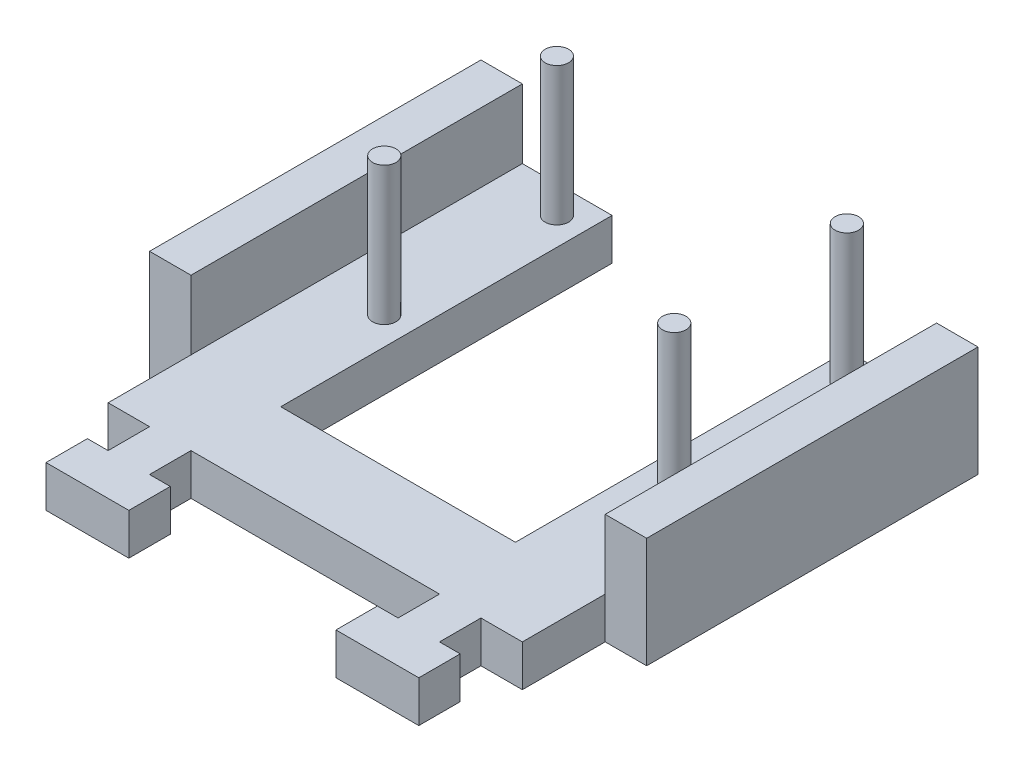
ISO-10303-21;
HEADER;
FILE_DESCRIPTION(('STEP AP214'),'2;1');
FILE_NAME('part.step','',(''),(''),'','','');
FILE_SCHEMA(('AUTOMOTIVE_DESIGN { 1 0 10303 214 1 1 1 1 }'));
ENDSEC;
DATA;
#1=APPLICATION_CONTEXT('core data for automotive mechanical design processes');
#2=APPLICATION_PROTOCOL_DEFINITION('international standard','automotive_design',2000,#1);
#3=PRODUCT_CONTEXT('',#1,'mechanical');
#4=PRODUCT('Part','Part','',(#3));
#5=PRODUCT_RELATED_PRODUCT_CATEGORY('part','',(#4));
#6=PRODUCT_DEFINITION_FORMATION('','',#4);
#7=PRODUCT_DEFINITION_CONTEXT('part definition',#1,'design');
#8=PRODUCT_DEFINITION('design','',#6,#7);
#9=PRODUCT_DEFINITION_SHAPE('','',#8);
#10=(LENGTH_UNIT() NAMED_UNIT(*) SI_UNIT(.MILLI.,.METRE.));
#11=(NAMED_UNIT(*) PLANE_ANGLE_UNIT() SI_UNIT($,.RADIAN.));
#12=(NAMED_UNIT(*) SI_UNIT($,.STERADIAN.) SOLID_ANGLE_UNIT());
#13=UNCERTAINTY_MEASURE_WITH_UNIT(LENGTH_MEASURE(1.E-05),#10,'distance_accuracy_value','');
#14=(GEOMETRIC_REPRESENTATION_CONTEXT(3) GLOBAL_UNCERTAINTY_ASSIGNED_CONTEXT((#13)) GLOBAL_UNIT_ASSIGNED_CONTEXT((#10,
#11,#12)) REPRESENTATION_CONTEXT('',''));
#15=CARTESIAN_POINT('',(0.,0.,0.));
#16=DIRECTION('',(0.,0.,1.));
#17=DIRECTION('',(1.,0.,0.));
#18=AXIS2_PLACEMENT_3D('',#15,#16,#17);
#19=CARTESIAN_POINT('',(0.,3.,0.));
#20=DIRECTION('',(0.,1.,0.));
#21=DIRECTION('',(0.,0.,1.));
#22=AXIS2_PLACEMENT_3D('',#19,#20,#21);
#23=PLANE('',#22);
#24=CARTESIAN_POINT('',(4.5,3.,-15.5));
#25=DIRECTION('',(0.,1.,0.));
#26=DIRECTION('',(0.,0.,1.));
#27=AXIS2_PLACEMENT_3D('',#24,#25,#26);
#28=CIRCLE('',#27,0.85);
#29=CARTESIAN_POINT('',(4.5,3.,-14.65));
#30=VERTEX_POINT('',#29);
#31=EDGE_CURVE('E915',#30,#30,#28,.T.);
#32=ORIENTED_EDGE('',*,*,#31,.F.);
#33=EDGE_LOOP('',(#32));
#34=FACE_BOUND('',#33,.T.);
#35=CARTESIAN_POINT('',(25.5,3.,-15.5));
#36=DIRECTION('',(0.,1.,0.));
#37=DIRECTION('',(0.,0.,1.));
#38=AXIS2_PLACEMENT_3D('',#35,#36,#37);
#39=CIRCLE('',#38,0.85);
#40=CARTESIAN_POINT('',(25.5,3.,-14.65));
#41=VERTEX_POINT('',#40);
#42=EDGE_CURVE('E918',#41,#41,#39,.T.);
#43=ORIENTED_EDGE('',*,*,#42,.F.);
#44=EDGE_LOOP('',(#43));
#45=FACE_BOUND('',#44,.T.);
#46=CARTESIAN_POINT('',(25.5,3.,-28.));
#47=DIRECTION('',(0.,1.,0.));
#48=DIRECTION('',(0.,0.,1.));
#49=AXIS2_PLACEMENT_3D('',#46,#47,#48);
#50=CIRCLE('',#49,0.85);
#51=CARTESIAN_POINT('',(25.5,3.,-27.15));
#52=VERTEX_POINT('',#51);
#53=EDGE_CURVE('E921',#52,#52,#50,.T.);
#54=ORIENTED_EDGE('',*,*,#53,.F.);
#55=EDGE_LOOP('',(#54));
#56=FACE_BOUND('',#55,.T.);
#57=CARTESIAN_POINT('',(4.5,3.,-28.));
#58=DIRECTION('',(0.,1.,0.));
#59=DIRECTION('',(0.,0.,1.));
#60=AXIS2_PLACEMENT_3D('',#57,#58,#59);
#61=CIRCLE('',#60,0.85);
#62=CARTESIAN_POINT('',(4.5,3.,-27.15));
#63=VERTEX_POINT('',#62);
#64=EDGE_CURVE('E924',#63,#63,#61,.T.);
#65=ORIENTED_EDGE('',*,*,#64,.F.);
#66=EDGE_LOOP('',(#65));
#67=FACE_BOUND('',#66,.T.);
#68=DIRECTION('',(0.,0.,-1.));
#69=VECTOR('',#68,1.);
#70=CARTESIAN_POINT('',(30.,3.,0.));
#71=LINE('',#70,#69);
#72=CARTESIAN_POINT('',(30.,3.,0.));
#73=VERTEX_POINT('',#72);
#74=CARTESIAN_POINT('',(30.,3.,-6.));
#75=VERTEX_POINT('',#74);
#76=EDGE_CURVE('E428',#73,#75,#71,.T.);
#77=ORIENTED_EDGE('',*,*,#76,.T.);
#78=DIRECTION('',(0.,0.,1.));
#79=VECTOR('',#78,1.);
#80=CARTESIAN_POINT('',(30.,3.,-30.));
#81=LINE('',#80,#79);
#82=CARTESIAN_POINT('',(30.,3.,-30.));
#83=VERTEX_POINT('',#82);
#84=EDGE_CURVE('E48',#83,#75,#81,.T.);
#85=ORIENTED_EDGE('',*,*,#84,.F.);
#86=DIRECTION('',(-1.,0.,0.));
#87=VECTOR('',#86,1.);
#88=CARTESIAN_POINT('',(23.5,3.,-30.));
#89=LINE('',#88,#87);
#90=CARTESIAN_POINT('',(23.5,3.,-30.));
#91=VERTEX_POINT('',#90);
#92=EDGE_CURVE('E430',#83,#91,#89,.T.);
#93=ORIENTED_EDGE('',*,*,#92,.T.);
#94=DIRECTION('',(0.,0.,1.));
#95=VECTOR('',#94,1.);
#96=CARTESIAN_POINT('',(23.5,3.,-6.));
#97=LINE('',#96,#95);
#98=CARTESIAN_POINT('',(23.5,3.,-6.));
#99=VERTEX_POINT('',#98);
#100=EDGE_CURVE('E226',#91,#99,#97,.T.);
#101=ORIENTED_EDGE('',*,*,#100,.T.);
#102=DIRECTION('',(-1.,0.,0.));
#103=VECTOR('',#102,1.);
#104=CARTESIAN_POINT('',(6.5,3.,-6.));
#105=LINE('',#104,#103);
#106=CARTESIAN_POINT('',(6.5,3.,-6.));
#107=VERTEX_POINT('',#106);
#108=EDGE_CURVE('E220',#99,#107,#105,.T.);
#109=ORIENTED_EDGE('',*,*,#108,.T.);
#110=DIRECTION('',(0.,0.,-1.));
#111=VECTOR('',#110,1.);
#112=CARTESIAN_POINT('',(6.5,3.,-30.));
#113=LINE('',#112,#111);
#114=CARTESIAN_POINT('',(6.5,3.,-30.));
#115=VERTEX_POINT('',#114);
#116=EDGE_CURVE('E223',#107,#115,#113,.T.);
#117=ORIENTED_EDGE('',*,*,#116,.T.);
#118=DIRECTION('',(-1.,0.,0.));
#119=VECTOR('',#118,1.);
#120=CARTESIAN_POINT('',(-3.,3.,-30.));
#121=LINE('',#120,#119);
#122=CARTESIAN_POINT('',(0.,3.,-30.));
#123=VERTEX_POINT('',#122);
#124=EDGE_CURVE('E244',#115,#123,#121,.T.);
#125=ORIENTED_EDGE('',*,*,#124,.T.);
#126=DIRECTION('',(0.,0.,-1.));
#127=VECTOR('',#126,1.);
#128=CARTESIAN_POINT('',(0.,3.,-6.));
#129=LINE('',#128,#127);
#130=CARTESIAN_POINT('',(0.,3.,-6.));
#131=VERTEX_POINT('',#130);
#132=EDGE_CURVE('E56',#131,#123,#129,.T.);
#133=ORIENTED_EDGE('',*,*,#132,.F.);
#134=DIRECTION('',(0.,0.,1.));
#135=VECTOR('',#134,1.);
#136=CARTESIAN_POINT('',(0.,3.,-6.));
#137=LINE('',#136,#135);
#138=CARTESIAN_POINT('',(0.,3.,0.));
#139=VERTEX_POINT('',#138);
#140=EDGE_CURVE('E306',#131,#139,#137,.T.);
#141=ORIENTED_EDGE('',*,*,#140,.T.);
#142=DIRECTION('',(1.,0.,0.));
#143=VECTOR('',#142,1.);
#144=CARTESIAN_POINT('',(0.,3.,0.));
#145=LINE('',#144,#143);
#146=CARTESIAN_POINT('',(3.,3.,0.));
#147=VERTEX_POINT('',#146);
#148=EDGE_CURVE('E158',#139,#147,#145,.T.);
#149=ORIENTED_EDGE('',*,*,#148,.T.);
#150=DIRECTION('',(0.,0.,1.));
#151=VECTOR('',#150,1.);
#152=CARTESIAN_POINT('',(3.,3.,0.));
#153=LINE('',#152,#151);
#154=CARTESIAN_POINT('',(3.,3.,3.));
#155=VERTEX_POINT('',#154);
#156=EDGE_CURVE('E380',#147,#155,#153,.T.);
#157=ORIENTED_EDGE('',*,*,#156,.T.);
#158=DIRECTION('',(-1.,0.,0.));
#159=VECTOR('',#158,1.);
#160=CARTESIAN_POINT('',(3.,3.,3.));
#161=LINE('',#160,#159);
#162=CARTESIAN_POINT('',(1.5,3.,3.));
#163=VERTEX_POINT('',#162);
#164=EDGE_CURVE('E398',#155,#163,#161,.T.);
#165=ORIENTED_EDGE('',*,*,#164,.T.);
#166=DIRECTION('',(0.,0.,1.));
#167=VECTOR('',#166,1.);
#168=CARTESIAN_POINT('',(1.5,3.,3.));
#169=LINE('',#168,#167);
#170=CARTESIAN_POINT('',(1.5,3.,6.));
#171=VERTEX_POINT('',#170);
#172=EDGE_CURVE('E395',#163,#171,#169,.T.);
#173=ORIENTED_EDGE('',*,*,#172,.T.);
#174=DIRECTION('',(1.,0.,0.));
#175=VECTOR('',#174,1.);
#176=CARTESIAN_POINT('',(1.5,3.,6.));
#177=LINE('',#176,#175);
#178=CARTESIAN_POINT('',(7.5,3.,6.));
#179=VERTEX_POINT('',#178);
#180=EDGE_CURVE('E397',#171,#179,#177,.T.);
#181=ORIENTED_EDGE('',*,*,#180,.T.);
#182=DIRECTION('',(0.,0.,-1.));
#183=VECTOR('',#182,1.);
#184=CARTESIAN_POINT('',(7.5,3.,6.));
#185=LINE('',#184,#183);
#186=CARTESIAN_POINT('',(7.5,3.,3.));
#187=VERTEX_POINT('',#186);
#188=EDGE_CURVE('E400',#179,#187,#185,.T.);
#189=ORIENTED_EDGE('',*,*,#188,.T.);
#190=DIRECTION('',(-1.,0.,0.));
#191=VECTOR('',#190,1.);
#192=CARTESIAN_POINT('',(7.5,3.,3.));
#193=LINE('',#192,#191);
#194=CARTESIAN_POINT('',(6.,3.,3.));
#195=VERTEX_POINT('',#194);
#196=EDGE_CURVE('E406',#187,#195,#193,.T.);
#197=ORIENTED_EDGE('',*,*,#196,.T.);
#198=DIRECTION('',(0.,0.,-1.));
#199=VECTOR('',#198,1.);
#200=CARTESIAN_POINT('',(6.,3.,3.));
#201=LINE('',#200,#199);
#202=CARTESIAN_POINT('',(6.,3.,0.));
#203=VERTEX_POINT('',#202);
#204=EDGE_CURVE('E408',#195,#203,#201,.T.);
#205=ORIENTED_EDGE('',*,*,#204,.T.);
#206=DIRECTION('',(1.,0.,0.));
#207=VECTOR('',#206,1.);
#208=CARTESIAN_POINT('',(6.,3.,0.));
#209=LINE('',#208,#207);
#210=CARTESIAN_POINT('',(24.,3.,0.));
#211=VERTEX_POINT('',#210);
#212=EDGE_CURVE('E410',#203,#211,#209,.T.);
#213=ORIENTED_EDGE('',*,*,#212,.T.);
#214=DIRECTION('',(0.,0.,1.));
#215=VECTOR('',#214,1.);
#216=CARTESIAN_POINT('',(24.,3.,0.));
#217=LINE('',#216,#215);
#218=CARTESIAN_POINT('',(24.,3.,3.));
#219=VERTEX_POINT('',#218);
#220=EDGE_CURVE('E412',#211,#219,#217,.T.);
#221=ORIENTED_EDGE('',*,*,#220,.T.);
#222=DIRECTION('',(-1.,0.,0.));
#223=VECTOR('',#222,1.);
#224=CARTESIAN_POINT('',(24.,3.,3.));
#225=LINE('',#224,#223);
#226=CARTESIAN_POINT('',(22.5,3.,3.));
#227=VERTEX_POINT('',#226);
#228=EDGE_CURVE('E414',#219,#227,#225,.T.);
#229=ORIENTED_EDGE('',*,*,#228,.T.);
#230=DIRECTION('',(0.,0.,1.));
#231=VECTOR('',#230,1.);
#232=CARTESIAN_POINT('',(22.5,3.,3.));
#233=LINE('',#232,#231);
#234=CARTESIAN_POINT('',(22.5,3.,6.));
#235=VERTEX_POINT('',#234);
#236=EDGE_CURVE('E416',#227,#235,#233,.T.);
#237=ORIENTED_EDGE('',*,*,#236,.T.);
#238=DIRECTION('',(1.,0.,0.));
#239=VECTOR('',#238,1.);
#240=CARTESIAN_POINT('',(22.5,3.,6.));
#241=LINE('',#240,#239);
#242=CARTESIAN_POINT('',(28.5,3.,6.));
#243=VERTEX_POINT('',#242);
#244=EDGE_CURVE('E418',#235,#243,#241,.T.);
#245=ORIENTED_EDGE('',*,*,#244,.T.);
#246=DIRECTION('',(0.,0.,-1.));
#247=VECTOR('',#246,1.);
#248=CARTESIAN_POINT('',(28.5,3.,6.));
#249=LINE('',#248,#247);
#250=CARTESIAN_POINT('',(28.5,3.,3.));
#251=VERTEX_POINT('',#250);
#252=EDGE_CURVE('E420',#243,#251,#249,.T.);
#253=ORIENTED_EDGE('',*,*,#252,.T.);
#254=DIRECTION('',(-1.,0.,0.));
#255=VECTOR('',#254,1.);
#256=CARTESIAN_POINT('',(28.5,3.,3.));
#257=LINE('',#256,#255);
#258=CARTESIAN_POINT('',(27.,3.,3.));
#259=VERTEX_POINT('',#258);
#260=EDGE_CURVE('E422',#251,#259,#257,.T.);
#261=ORIENTED_EDGE('',*,*,#260,.T.);
#262=DIRECTION('',(0.,0.,-1.));
#263=VECTOR('',#262,1.);
#264=CARTESIAN_POINT('',(27.,3.,3.));
#265=LINE('',#264,#263);
#266=CARTESIAN_POINT('',(27.,3.,0.));
#267=VERTEX_POINT('',#266);
#268=EDGE_CURVE('E424',#259,#267,#265,.T.);
#269=ORIENTED_EDGE('',*,*,#268,.T.);
#270=DIRECTION('',(1.,0.,0.));
#271=VECTOR('',#270,1.);
#272=CARTESIAN_POINT('',(27.,3.,0.));
#273=LINE('',#272,#271);
#274=EDGE_CURVE('E426',#267,#73,#273,.T.);
#275=ORIENTED_EDGE('',*,*,#274,.T.);
#276=EDGE_LOOP('',(#77,#85,#93,#101,#109,#117,#125,#133,#141,#149,#157,#165,#173,#181,#189,#197,
#205,#213,#221,#229,#237,#245,#253,#261,#269,#275));
#277=FACE_BOUND('',#276,.T.);
#278=ADVANCED_FACE('F33',(#34,#45,#56,#67,#277),#23,.T.);
#279=CARTESIAN_POINT('',(0.,3.,-6.));
#280=DIRECTION('',(1.,0.,0.));
#281=DIRECTION('',(0.,0.,-1.));
#282=AXIS2_PLACEMENT_3D('',#279,#280,#281);
#283=PLANE('',#282);
#284=DIRECTION('',(0.,0.,1.));
#285=VECTOR('',#284,1.);
#286=CARTESIAN_POINT('',(0.,0.,-6.));
#287=LINE('',#286,#285);
#288=CARTESIAN_POINT('',(0.,0.,-6.));
#289=VERTEX_POINT('',#288);
#290=CARTESIAN_POINT('',(0.,0.,0.));
#291=VERTEX_POINT('',#290);
#292=EDGE_CURVE('E250',#289,#291,#287,.T.);
#293=ORIENTED_EDGE('',*,*,#292,.T.);
#294=DIRECTION('',(0.,-1.,0.));
#295=VECTOR('',#294,1.);
#296=CARTESIAN_POINT('',(0.,3.,0.));
#297=LINE('',#296,#295);
#298=EDGE_CURVE('E11',#139,#291,#297,.T.);
#299=ORIENTED_EDGE('',*,*,#298,.F.);
#300=ORIENTED_EDGE('',*,*,#140,.F.);
#301=DIRECTION('',(0.,-1.,0.));
#302=VECTOR('',#301,1.);
#303=CARTESIAN_POINT('',(0.,3.,-6.));
#304=LINE('',#303,#302);
#305=EDGE_CURVE('E246',#131,#289,#304,.T.);
#306=ORIENTED_EDGE('',*,*,#305,.T.);
#307=EDGE_LOOP('',(#293,#299,#300,#306));
#308=FACE_BOUND('',#307,.T.);
#309=ADVANCED_FACE('F35',(#308),#283,.F.);
#310=CARTESIAN_POINT('',(0.,3.,0.));
#311=DIRECTION('',(0.,0.,-1.));
#312=DIRECTION('',(-1.,0.,0.));
#313=AXIS2_PLACEMENT_3D('',#310,#311,#312);
#314=PLANE('',#313);
#315=DIRECTION('',(1.,0.,0.));
#316=VECTOR('',#315,1.);
#317=CARTESIAN_POINT('',(0.,0.,0.));
#318=LINE('',#317,#316);
#319=CARTESIAN_POINT('',(3.,0.,0.));
#320=VERTEX_POINT('',#319);
#321=EDGE_CURVE('E253',#291,#320,#318,.T.);
#322=ORIENTED_EDGE('',*,*,#321,.T.);
#323=DIRECTION('',(0.,-1.,0.));
#324=VECTOR('',#323,1.);
#325=CARTESIAN_POINT('',(3.,3.,0.));
#326=LINE('',#325,#324);
#327=EDGE_CURVE('E41',#147,#320,#326,.T.);
#328=ORIENTED_EDGE('',*,*,#327,.F.);
#329=ORIENTED_EDGE('',*,*,#148,.F.);
#330=ORIENTED_EDGE('',*,*,#298,.T.);
#331=EDGE_LOOP('',(#322,#328,#329,#330));
#332=FACE_BOUND('',#331,.T.);
#333=ADVANCED_FACE('F475',(#332),#314,.F.);
#334=CARTESIAN_POINT('',(3.,3.,0.));
#335=DIRECTION('',(1.,0.,0.));
#336=DIRECTION('',(0.,0.,-1.));
#337=AXIS2_PLACEMENT_3D('',#334,#335,#336);
#338=PLANE('',#337);
#339=DIRECTION('',(0.,0.,1.));
#340=VECTOR('',#339,1.);
#341=CARTESIAN_POINT('',(3.,0.,0.));
#342=LINE('',#341,#340);
#343=CARTESIAN_POINT('',(3.,0.,3.));
#344=VERTEX_POINT('',#343);
#345=EDGE_CURVE('E256',#320,#344,#342,.T.);
#346=ORIENTED_EDGE('',*,*,#345,.T.);
#347=DIRECTION('',(0.,-1.,0.));
#348=VECTOR('',#347,1.);
#349=CARTESIAN_POINT('',(3.,3.,3.));
#350=LINE('',#349,#348);
#351=EDGE_CURVE('E372',#155,#344,#350,.T.);
#352=ORIENTED_EDGE('',*,*,#351,.F.);
#353=ORIENTED_EDGE('',*,*,#156,.F.);
#354=ORIENTED_EDGE('',*,*,#327,.T.);
#355=EDGE_LOOP('',(#346,#352,#353,#354));
#356=FACE_BOUND('',#355,.T.);
#357=ADVANCED_FACE('F378',(#356),#338,.F.);
#358=CARTESIAN_POINT('',(3.,3.,3.));
#359=DIRECTION('',(0.,0.,1.));
#360=DIRECTION('',(1.,0.,0.));
#361=AXIS2_PLACEMENT_3D('',#358,#359,#360);
#362=PLANE('',#361);
#363=DIRECTION('',(-1.,0.,0.));
#364=VECTOR('',#363,1.);
#365=CARTESIAN_POINT('',(3.,0.,3.));
#366=LINE('',#365,#364);
#367=CARTESIAN_POINT('',(1.5,0.,3.));
#368=VERTEX_POINT('',#367);
#369=EDGE_CURVE('E258',#344,#368,#366,.T.);
#370=ORIENTED_EDGE('',*,*,#369,.T.);
#371=DIRECTION('',(0.,-1.,0.));
#372=VECTOR('',#371,1.);
#373=CARTESIAN_POINT('',(1.5,3.,3.));
#374=LINE('',#373,#372);
#375=EDGE_CURVE('E369',#163,#368,#374,.T.);
#376=ORIENTED_EDGE('',*,*,#375,.F.);
#377=ORIENTED_EDGE('',*,*,#164,.F.);
#378=ORIENTED_EDGE('',*,*,#351,.T.);
#379=EDGE_LOOP('',(#370,#376,#377,#378));
#380=FACE_BOUND('',#379,.T.);
#381=ADVANCED_FACE('F389',(#380),#362,.F.);
#382=CARTESIAN_POINT('',(1.5,3.,3.));
#383=DIRECTION('',(1.,0.,0.));
#384=DIRECTION('',(0.,0.,-1.));
#385=AXIS2_PLACEMENT_3D('',#382,#383,#384);
#386=PLANE('',#385);
#387=DIRECTION('',(0.,0.,1.));
#388=VECTOR('',#387,1.);
#389=CARTESIAN_POINT('',(1.5,0.,3.));
#390=LINE('',#389,#388);
#391=CARTESIAN_POINT('',(1.5,0.,6.));
#392=VERTEX_POINT('',#391);
#393=EDGE_CURVE('E260',#368,#392,#390,.T.);
#394=ORIENTED_EDGE('',*,*,#393,.T.);
#395=DIRECTION('',(0.,-1.,0.));
#396=VECTOR('',#395,1.);
#397=CARTESIAN_POINT('',(1.5,3.,6.));
#398=LINE('',#397,#396);
#399=EDGE_CURVE('E366',#171,#392,#398,.T.);
#400=ORIENTED_EDGE('',*,*,#399,.F.);
#401=ORIENTED_EDGE('',*,*,#172,.F.);
#402=ORIENTED_EDGE('',*,*,#375,.T.);
#403=EDGE_LOOP('',(#394,#400,#401,#402));
#404=FACE_BOUND('',#403,.T.);
#405=ADVANCED_FACE('F393',(#404),#386,.F.);
#406=CARTESIAN_POINT('',(1.5,3.,6.));
#407=DIRECTION('',(0.,0.,-1.));
#408=DIRECTION('',(-1.,0.,0.));
#409=AXIS2_PLACEMENT_3D('',#406,#407,#408);
#410=PLANE('',#409);
#411=DIRECTION('',(1.,0.,0.));
#412=VECTOR('',#411,1.);
#413=CARTESIAN_POINT('',(1.5,0.,6.));
#414=LINE('',#413,#412);
#415=CARTESIAN_POINT('',(7.5,0.,6.));
#416=VERTEX_POINT('',#415);
#417=EDGE_CURVE('E262',#392,#416,#414,.T.);
#418=ORIENTED_EDGE('',*,*,#417,.T.);
#419=DIRECTION('',(0.,-1.,0.));
#420=VECTOR('',#419,1.);
#421=CARTESIAN_POINT('',(7.5,3.,6.));
#422=LINE('',#421,#420);
#423=EDGE_CURVE('E363',#179,#416,#422,.T.);
#424=ORIENTED_EDGE('',*,*,#423,.F.);
#425=ORIENTED_EDGE('',*,*,#180,.F.);
#426=ORIENTED_EDGE('',*,*,#399,.T.);
#427=EDGE_LOOP('',(#418,#424,#425,#426));
#428=FACE_BOUND('',#427,.T.);
#429=ADVANCED_FACE('F570',(#428),#410,.F.);
#430=CARTESIAN_POINT('',(7.5,3.,6.));
#431=DIRECTION('',(-1.,0.,0.));
#432=DIRECTION('',(0.,0.,1.));
#433=AXIS2_PLACEMENT_3D('',#430,#431,#432);
#434=PLANE('',#433);
#435=DIRECTION('',(0.,0.,-1.));
#436=VECTOR('',#435,1.);
#437=CARTESIAN_POINT('',(7.5,0.,6.));
#438=LINE('',#437,#436);
#439=CARTESIAN_POINT('',(7.5,0.,3.));
#440=VERTEX_POINT('',#439);
#441=EDGE_CURVE('E264',#416,#440,#438,.T.);
#442=ORIENTED_EDGE('',*,*,#441,.T.);
#443=DIRECTION('',(0.,-1.,0.));
#444=VECTOR('',#443,1.);
#445=CARTESIAN_POINT('',(7.5,3.,3.));
#446=LINE('',#445,#444);
#447=EDGE_CURVE('E360',#187,#440,#446,.T.);
#448=ORIENTED_EDGE('',*,*,#447,.F.);
#449=ORIENTED_EDGE('',*,*,#188,.F.);
#450=ORIENTED_EDGE('',*,*,#423,.T.);
#451=EDGE_LOOP('',(#442,#448,#449,#450));
#452=FACE_BOUND('',#451,.T.);
#453=ADVANCED_FACE('F566',(#452),#434,.F.);
#454=CARTESIAN_POINT('',(7.5,3.,3.));
#455=DIRECTION('',(0.,0.,1.));
#456=DIRECTION('',(1.,0.,0.));
#457=AXIS2_PLACEMENT_3D('',#454,#455,#456);
#458=PLANE('',#457);
#459=DIRECTION('',(-1.,0.,0.));
#460=VECTOR('',#459,1.);
#461=CARTESIAN_POINT('',(7.5,0.,3.));
#462=LINE('',#461,#460);
#463=CARTESIAN_POINT('',(6.,0.,3.));
#464=VERTEX_POINT('',#463);
#465=EDGE_CURVE('E266',#440,#464,#462,.T.);
#466=ORIENTED_EDGE('',*,*,#465,.T.);
#467=DIRECTION('',(0.,-1.,0.));
#468=VECTOR('',#467,1.);
#469=CARTESIAN_POINT('',(6.,3.,3.));
#470=LINE('',#469,#468);
#471=EDGE_CURVE('E357',#195,#464,#470,.T.);
#472=ORIENTED_EDGE('',*,*,#471,.F.);
#473=ORIENTED_EDGE('',*,*,#196,.F.);
#474=ORIENTED_EDGE('',*,*,#447,.T.);
#475=EDGE_LOOP('',(#466,#472,#473,#474));
#476=FACE_BOUND('',#475,.T.);
#477=ADVANCED_FACE('F562',(#476),#458,.F.);
#478=CARTESIAN_POINT('',(6.,3.,3.));
#479=DIRECTION('',(-1.,0.,0.));
#480=DIRECTION('',(0.,0.,1.));
#481=AXIS2_PLACEMENT_3D('',#478,#479,#480);
#482=PLANE('',#481);
#483=DIRECTION('',(0.,0.,-1.));
#484=VECTOR('',#483,1.);
#485=CARTESIAN_POINT('',(6.,0.,3.));
#486=LINE('',#485,#484);
#487=CARTESIAN_POINT('',(6.,0.,0.));
#488=VERTEX_POINT('',#487);
#489=EDGE_CURVE('E268',#464,#488,#486,.T.);
#490=ORIENTED_EDGE('',*,*,#489,.T.);
#491=DIRECTION('',(0.,-1.,0.));
#492=VECTOR('',#491,1.);
#493=CARTESIAN_POINT('',(6.,3.,0.));
#494=LINE('',#493,#492);
#495=EDGE_CURVE('E354',#203,#488,#494,.T.);
#496=ORIENTED_EDGE('',*,*,#495,.F.);
#497=ORIENTED_EDGE('',*,*,#204,.F.);
#498=ORIENTED_EDGE('',*,*,#471,.T.);
#499=EDGE_LOOP('',(#490,#496,#497,#498));
#500=FACE_BOUND('',#499,.T.);
#501=ADVANCED_FACE('F558',(#500),#482,.F.);
#502=CARTESIAN_POINT('',(6.,3.,0.));
#503=DIRECTION('',(0.,0.,-1.));
#504=DIRECTION('',(-1.,0.,0.));
#505=AXIS2_PLACEMENT_3D('',#502,#503,#504);
#506=PLANE('',#505);
#507=DIRECTION('',(1.,0.,0.));
#508=VECTOR('',#507,1.);
#509=CARTESIAN_POINT('',(6.,0.,0.));
#510=LINE('',#509,#508);
#511=CARTESIAN_POINT('',(24.,0.,0.));
#512=VERTEX_POINT('',#511);
#513=EDGE_CURVE('E270',#488,#512,#510,.T.);
#514=ORIENTED_EDGE('',*,*,#513,.T.);
#515=DIRECTION('',(0.,-1.,0.));
#516=VECTOR('',#515,1.);
#517=CARTESIAN_POINT('',(24.,3.,0.));
#518=LINE('',#517,#516);
#519=EDGE_CURVE('E351',#211,#512,#518,.T.);
#520=ORIENTED_EDGE('',*,*,#519,.F.);
#521=ORIENTED_EDGE('',*,*,#212,.F.);
#522=ORIENTED_EDGE('',*,*,#495,.T.);
#523=EDGE_LOOP('',(#514,#520,#521,#522));
#524=FACE_BOUND('',#523,.T.);
#525=ADVANCED_FACE('F554',(#524),#506,.F.);
#526=CARTESIAN_POINT('',(24.,3.,0.));
#527=DIRECTION('',(1.,0.,0.));
#528=DIRECTION('',(0.,0.,-1.));
#529=AXIS2_PLACEMENT_3D('',#526,#527,#528);
#530=PLANE('',#529);
#531=DIRECTION('',(0.,0.,1.));
#532=VECTOR('',#531,1.);
#533=CARTESIAN_POINT('',(24.,0.,0.));
#534=LINE('',#533,#532);
#535=CARTESIAN_POINT('',(24.,0.,3.));
#536=VERTEX_POINT('',#535);
#537=EDGE_CURVE('E272',#512,#536,#534,.T.);
#538=ORIENTED_EDGE('',*,*,#537,.T.);
#539=DIRECTION('',(0.,-1.,0.));
#540=VECTOR('',#539,1.);
#541=CARTESIAN_POINT('',(24.,3.,3.));
#542=LINE('',#541,#540);
#543=EDGE_CURVE('E348',#219,#536,#542,.T.);
#544=ORIENTED_EDGE('',*,*,#543,.F.);
#545=ORIENTED_EDGE('',*,*,#220,.F.);
#546=ORIENTED_EDGE('',*,*,#519,.T.);
#547=EDGE_LOOP('',(#538,#544,#545,#546));
#548=FACE_BOUND('',#547,.T.);
#549=ADVANCED_FACE('F550',(#548),#530,.F.);
#550=CARTESIAN_POINT('',(24.,3.,3.));
#551=DIRECTION('',(0.,0.,1.));
#552=DIRECTION('',(1.,0.,0.));
#553=AXIS2_PLACEMENT_3D('',#550,#551,#552);
#554=PLANE('',#553);
#555=DIRECTION('',(-1.,0.,0.));
#556=VECTOR('',#555,1.);
#557=CARTESIAN_POINT('',(24.,0.,3.));
#558=LINE('',#557,#556);
#559=CARTESIAN_POINT('',(22.5,0.,3.));
#560=VERTEX_POINT('',#559);
#561=EDGE_CURVE('E274',#536,#560,#558,.T.);
#562=ORIENTED_EDGE('',*,*,#561,.T.);
#563=DIRECTION('',(0.,-1.,0.));
#564=VECTOR('',#563,1.);
#565=CARTESIAN_POINT('',(22.5,3.,3.));
#566=LINE('',#565,#564);
#567=EDGE_CURVE('E345',#227,#560,#566,.T.);
#568=ORIENTED_EDGE('',*,*,#567,.F.);
#569=ORIENTED_EDGE('',*,*,#228,.F.);
#570=ORIENTED_EDGE('',*,*,#543,.T.);
#571=EDGE_LOOP('',(#562,#568,#569,#570));
#572=FACE_BOUND('',#571,.T.);
#573=ADVANCED_FACE('F546',(#572),#554,.F.);
#574=CARTESIAN_POINT('',(22.5,3.,3.));
#575=DIRECTION('',(1.,0.,0.));
#576=DIRECTION('',(0.,0.,-1.));
#577=AXIS2_PLACEMENT_3D('',#574,#575,#576);
#578=PLANE('',#577);
#579=DIRECTION('',(0.,0.,1.));
#580=VECTOR('',#579,1.);
#581=CARTESIAN_POINT('',(22.5,0.,3.));
#582=LINE('',#581,#580);
#583=CARTESIAN_POINT('',(22.5,0.,6.));
#584=VERTEX_POINT('',#583);
#585=EDGE_CURVE('E276',#560,#584,#582,.T.);
#586=ORIENTED_EDGE('',*,*,#585,.T.);
#587=DIRECTION('',(0.,-1.,0.));
#588=VECTOR('',#587,1.);
#589=CARTESIAN_POINT('',(22.5,3.,6.));
#590=LINE('',#589,#588);
#591=EDGE_CURVE('E342',#235,#584,#590,.T.);
#592=ORIENTED_EDGE('',*,*,#591,.F.);
#593=ORIENTED_EDGE('',*,*,#236,.F.);
#594=ORIENTED_EDGE('',*,*,#567,.T.);
#595=EDGE_LOOP('',(#586,#592,#593,#594));
#596=FACE_BOUND('',#595,.T.);
#597=ADVANCED_FACE('F542',(#596),#578,.F.);
#598=CARTESIAN_POINT('',(22.5,3.,6.));
#599=DIRECTION('',(0.,0.,-1.));
#600=DIRECTION('',(-1.,0.,0.));
#601=AXIS2_PLACEMENT_3D('',#598,#599,#600);
#602=PLANE('',#601);
#603=DIRECTION('',(1.,0.,0.));
#604=VECTOR('',#603,1.);
#605=CARTESIAN_POINT('',(22.5,0.,6.));
#606=LINE('',#605,#604);
#607=CARTESIAN_POINT('',(28.5,0.,6.));
#608=VERTEX_POINT('',#607);
#609=EDGE_CURVE('E278',#584,#608,#606,.T.);
#610=ORIENTED_EDGE('',*,*,#609,.T.);
#611=DIRECTION('',(0.,-1.,0.));
#612=VECTOR('',#611,1.);
#613=CARTESIAN_POINT('',(28.5,3.,6.));
#614=LINE('',#613,#612);
#615=EDGE_CURVE('E339',#243,#608,#614,.T.);
#616=ORIENTED_EDGE('',*,*,#615,.F.);
#617=ORIENTED_EDGE('',*,*,#244,.F.);
#618=ORIENTED_EDGE('',*,*,#591,.T.);
#619=EDGE_LOOP('',(#610,#616,#617,#618));
#620=FACE_BOUND('',#619,.T.);
#621=ADVANCED_FACE('F538',(#620),#602,.F.);
#622=CARTESIAN_POINT('',(28.5,3.,6.));
#623=DIRECTION('',(-1.,0.,0.));
#624=DIRECTION('',(0.,0.,1.));
#625=AXIS2_PLACEMENT_3D('',#622,#623,#624);
#626=PLANE('',#625);
#627=DIRECTION('',(0.,0.,-1.));
#628=VECTOR('',#627,1.);
#629=CARTESIAN_POINT('',(28.5,0.,6.));
#630=LINE('',#629,#628);
#631=CARTESIAN_POINT('',(28.5,0.,3.));
#632=VERTEX_POINT('',#631);
#633=EDGE_CURVE('E280',#608,#632,#630,.T.);
#634=ORIENTED_EDGE('',*,*,#633,.T.);
#635=DIRECTION('',(0.,-1.,0.));
#636=VECTOR('',#635,1.);
#637=CARTESIAN_POINT('',(28.5,3.,3.));
#638=LINE('',#637,#636);
#639=EDGE_CURVE('E336',#251,#632,#638,.T.);
#640=ORIENTED_EDGE('',*,*,#639,.F.);
#641=ORIENTED_EDGE('',*,*,#252,.F.);
#642=ORIENTED_EDGE('',*,*,#615,.T.);
#643=EDGE_LOOP('',(#634,#640,#641,#642));
#644=FACE_BOUND('',#643,.T.);
#645=ADVANCED_FACE('F534',(#644),#626,.F.);
#646=CARTESIAN_POINT('',(28.5,3.,3.));
#647=DIRECTION('',(0.,0.,1.));
#648=DIRECTION('',(1.,0.,0.));
#649=AXIS2_PLACEMENT_3D('',#646,#647,#648);
#650=PLANE('',#649);
#651=DIRECTION('',(-1.,0.,0.));
#652=VECTOR('',#651,1.);
#653=CARTESIAN_POINT('',(28.5,0.,3.));
#654=LINE('',#653,#652);
#655=CARTESIAN_POINT('',(27.,0.,3.));
#656=VERTEX_POINT('',#655);
#657=EDGE_CURVE('E282',#632,#656,#654,.T.);
#658=ORIENTED_EDGE('',*,*,#657,.T.);
#659=DIRECTION('',(0.,-1.,0.));
#660=VECTOR('',#659,1.);
#661=CARTESIAN_POINT('',(27.,3.,3.));
#662=LINE('',#661,#660);
#663=EDGE_CURVE('E333',#259,#656,#662,.T.);
#664=ORIENTED_EDGE('',*,*,#663,.F.);
#665=ORIENTED_EDGE('',*,*,#260,.F.);
#666=ORIENTED_EDGE('',*,*,#639,.T.);
#667=EDGE_LOOP('',(#658,#664,#665,#666));
#668=FACE_BOUND('',#667,.T.);
#669=ADVANCED_FACE('F530',(#668),#650,.F.);
#670=CARTESIAN_POINT('',(27.,3.,3.));
#671=DIRECTION('',(-1.,0.,0.));
#672=DIRECTION('',(0.,0.,1.));
#673=AXIS2_PLACEMENT_3D('',#670,#671,#672);
#674=PLANE('',#673);
#675=DIRECTION('',(0.,0.,-1.));
#676=VECTOR('',#675,1.);
#677=CARTESIAN_POINT('',(27.,0.,3.));
#678=LINE('',#677,#676);
#679=CARTESIAN_POINT('',(27.,0.,0.));
#680=VERTEX_POINT('',#679);
#681=EDGE_CURVE('E284',#656,#680,#678,.T.);
#682=ORIENTED_EDGE('',*,*,#681,.T.);
#683=DIRECTION('',(0.,-1.,0.));
#684=VECTOR('',#683,1.);
#685=CARTESIAN_POINT('',(27.,3.,0.));
#686=LINE('',#685,#684);
#687=EDGE_CURVE('E330',#267,#680,#686,.T.);
#688=ORIENTED_EDGE('',*,*,#687,.F.);
#689=ORIENTED_EDGE('',*,*,#268,.F.);
#690=ORIENTED_EDGE('',*,*,#663,.T.);
#691=EDGE_LOOP('',(#682,#688,#689,#690));
#692=FACE_BOUND('',#691,.T.);
#693=ADVANCED_FACE('F526',(#692),#674,.F.);
#694=CARTESIAN_POINT('',(27.,3.,0.));
#695=DIRECTION('',(0.,0.,-1.));
#696=DIRECTION('',(-1.,0.,0.));
#697=AXIS2_PLACEMENT_3D('',#694,#695,#696);
#698=PLANE('',#697);
#699=DIRECTION('',(1.,0.,0.));
#700=VECTOR('',#699,1.);
#701=CARTESIAN_POINT('',(27.,0.,0.));
#702=LINE('',#701,#700);
#703=CARTESIAN_POINT('',(30.,0.,0.));
#704=VERTEX_POINT('',#703);
#705=EDGE_CURVE('E286',#680,#704,#702,.T.);
#706=ORIENTED_EDGE('',*,*,#705,.T.);
#707=DIRECTION('',(0.,-1.,0.));
#708=VECTOR('',#707,1.);
#709=CARTESIAN_POINT('',(30.,3.,0.));
#710=LINE('',#709,#708);
#711=EDGE_CURVE('E327',#73,#704,#710,.T.);
#712=ORIENTED_EDGE('',*,*,#711,.F.);
#713=ORIENTED_EDGE('',*,*,#274,.F.);
#714=ORIENTED_EDGE('',*,*,#687,.T.);
#715=EDGE_LOOP('',(#706,#712,#713,#714));
#716=FACE_BOUND('',#715,.T.);
#717=ADVANCED_FACE('F522',(#716),#698,.F.);
#718=CARTESIAN_POINT('',(30.,3.,0.));
#719=DIRECTION('',(-1.,0.,0.));
#720=DIRECTION('',(0.,0.,1.));
#721=AXIS2_PLACEMENT_3D('',#718,#719,#720);
#722=PLANE('',#721);
#723=DIRECTION('',(0.,0.,-1.));
#724=VECTOR('',#723,1.);
#725=CARTESIAN_POINT('',(30.,0.,0.));
#726=LINE('',#725,#724);
#727=CARTESIAN_POINT('',(30.,0.,-6.));
#728=VERTEX_POINT('',#727);
#729=EDGE_CURVE('E288',#704,#728,#726,.T.);
#730=ORIENTED_EDGE('',*,*,#729,.T.);
#731=DIRECTION('',(0.,-1.,0.));
#732=VECTOR('',#731,1.);
#733=CARTESIAN_POINT('',(30.,3.,-6.));
#734=LINE('',#733,#732);
#735=EDGE_CURVE('E324',#75,#728,#734,.T.);
#736=ORIENTED_EDGE('',*,*,#735,.F.);
#737=ORIENTED_EDGE('',*,*,#76,.F.);
#738=ORIENTED_EDGE('',*,*,#711,.T.);
#739=EDGE_LOOP('',(#730,#736,#737,#738));
#740=FACE_BOUND('',#739,.T.);
#741=ADVANCED_FACE('F518',(#740),#722,.F.);
#742=CARTESIAN_POINT('',(30.,3.,-6.));
#743=DIRECTION('',(0.,0.,-1.));
#744=DIRECTION('',(-1.,0.,0.));
#745=AXIS2_PLACEMENT_3D('',#742,#743,#744);
#746=PLANE('',#745);
#747=DIRECTION('',(1.,0.,0.));
#748=VECTOR('',#747,1.);
#749=CARTESIAN_POINT('',(30.,0.,-6.));
#750=LINE('',#749,#748);
#751=CARTESIAN_POINT('',(33.,0.,-6.));
#752=VERTEX_POINT('',#751);
#753=EDGE_CURVE('E290',#728,#752,#750,.T.);
#754=ORIENTED_EDGE('',*,*,#753,.T.);
#755=DIRECTION('',(0.,-1.,0.));
#756=VECTOR('',#755,1.);
#757=CARTESIAN_POINT('',(33.,3.,-6.));
#758=LINE('',#757,#756);
#759=CARTESIAN_POINT('',(33.,8.,-6.));
#760=VERTEX_POINT('',#759);
#761=EDGE_CURVE('E321',#760,#752,#758,.T.);
#762=ORIENTED_EDGE('',*,*,#761,.F.);
#763=DIRECTION('',(1.,0.,0.));
#764=VECTOR('',#763,1.);
#765=CARTESIAN_POINT('',(30.,8.,-6.));
#766=LINE('',#765,#764);
#767=CARTESIAN_POINT('',(30.,8.,-6.));
#768=VERTEX_POINT('',#767);
#769=EDGE_CURVE('E936',#768,#760,#766,.T.);
#770=ORIENTED_EDGE('',*,*,#769,.F.);
#771=DIRECTION('',(0.,-1.,0.));
#772=VECTOR('',#771,1.);
#773=CARTESIAN_POINT('',(30.,8.,-6.));
#774=LINE('',#773,#772);
#775=EDGE_CURVE('E463',#768,#75,#774,.T.);
#776=ORIENTED_EDGE('',*,*,#775,.T.);
#777=ORIENTED_EDGE('',*,*,#735,.T.);
#778=EDGE_LOOP('',(#754,#762,#770,#776,#777));
#779=FACE_BOUND('',#778,.T.);
#780=ADVANCED_FACE('F514',(#779),#746,.F.);
#781=CARTESIAN_POINT('',(33.,3.,-6.));
#782=DIRECTION('',(-1.,0.,0.));
#783=DIRECTION('',(0.,0.,1.));
#784=AXIS2_PLACEMENT_3D('',#781,#782,#783);
#785=PLANE('',#784);
#786=DIRECTION('',(0.,0.,-1.));
#787=VECTOR('',#786,1.);
#788=CARTESIAN_POINT('',(33.,0.,-6.));
#789=LINE('',#788,#787);
#790=CARTESIAN_POINT('',(33.,0.,-30.));
#791=VERTEX_POINT('',#790);
#792=EDGE_CURVE('E292',#752,#791,#789,.T.);
#793=ORIENTED_EDGE('',*,*,#792,.T.);
#794=DIRECTION('',(0.,-1.,0.));
#795=VECTOR('',#794,1.);
#796=CARTESIAN_POINT('',(33.,3.,-30.));
#797=LINE('',#796,#795);
#798=CARTESIAN_POINT('',(33.,8.,-30.));
#799=VERTEX_POINT('',#798);
#800=EDGE_CURVE('E318',#799,#791,#797,.T.);
#801=ORIENTED_EDGE('',*,*,#800,.F.);
#802=DIRECTION('',(0.,0.,-1.));
#803=VECTOR('',#802,1.);
#804=CARTESIAN_POINT('',(33.,8.,-6.));
#805=LINE('',#804,#803);
#806=EDGE_CURVE('E927',#760,#799,#805,.T.);
#807=ORIENTED_EDGE('',*,*,#806,.F.);
#808=ORIENTED_EDGE('',*,*,#761,.T.);
#809=EDGE_LOOP('',(#793,#801,#807,#808));
#810=FACE_BOUND('',#809,.T.);
#811=ADVANCED_FACE('F511',(#810),#785,.F.);
#812=CARTESIAN_POINT('',(23.5,3.,-30.));
#813=DIRECTION('',(0.,0.,1.));
#814=DIRECTION('',(1.,0.,0.));
#815=AXIS2_PLACEMENT_3D('',#812,#813,#814);
#816=PLANE('',#815);
#817=DIRECTION('',(-1.,0.,0.));
#818=VECTOR('',#817,1.);
#819=CARTESIAN_POINT('',(23.5,0.,-30.));
#820=LINE('',#819,#818);
#821=CARTESIAN_POINT('',(23.5,0.,-30.));
#822=VERTEX_POINT('',#821);
#823=EDGE_CURVE('E294',#791,#822,#820,.T.);
#824=ORIENTED_EDGE('',*,*,#823,.T.);
#825=DIRECTION('',(0.,-1.,0.));
#826=VECTOR('',#825,1.);
#827=CARTESIAN_POINT('',(23.5,3.,-30.));
#828=LINE('',#827,#826);
#829=EDGE_CURVE('E315',#91,#822,#828,.T.);
#830=ORIENTED_EDGE('',*,*,#829,.F.);
#831=ORIENTED_EDGE('',*,*,#92,.F.);
#832=DIRECTION('',(0.,-1.,0.));
#833=VECTOR('',#832,1.);
#834=CARTESIAN_POINT('',(30.,8.,-30.));
#835=LINE('',#834,#833);
#836=CARTESIAN_POINT('',(30.,8.,-30.));
#837=VERTEX_POINT('',#836);
#838=EDGE_CURVE('E458',#837,#83,#835,.T.);
#839=ORIENTED_EDGE('',*,*,#838,.F.);
#840=DIRECTION('',(-1.,0.,0.));
#841=VECTOR('',#840,1.);
#842=CARTESIAN_POINT('',(33.,8.,-30.));
#843=LINE('',#842,#841);
#844=EDGE_CURVE('E930',#799,#837,#843,.T.);
#845=ORIENTED_EDGE('',*,*,#844,.F.);
#846=ORIENTED_EDGE('',*,*,#800,.T.);
#847=EDGE_LOOP('',(#824,#830,#831,#839,#845,#846));
#848=FACE_BOUND('',#847,.T.);
#849=ADVANCED_FACE('F435',(#848),#816,.F.);
#850=CARTESIAN_POINT('',(23.5,3.,-6.));
#851=DIRECTION('',(1.,0.,0.));
#852=DIRECTION('',(0.,0.,-1.));
#853=AXIS2_PLACEMENT_3D('',#850,#851,#852);
#854=PLANE('',#853);
#855=DIRECTION('',(0.,0.,1.));
#856=VECTOR('',#855,1.);
#857=CARTESIAN_POINT('',(23.5,0.,-6.));
#858=LINE('',#857,#856);
#859=CARTESIAN_POINT('',(23.5,0.,-6.));
#860=VERTEX_POINT('',#859);
#861=EDGE_CURVE('E296',#822,#860,#858,.T.);
#862=ORIENTED_EDGE('',*,*,#861,.T.);
#863=DIRECTION('',(0.,-1.,0.));
#864=VECTOR('',#863,1.);
#865=CARTESIAN_POINT('',(23.5,3.,-6.));
#866=LINE('',#865,#864);
#867=EDGE_CURVE('E238',#99,#860,#866,.T.);
#868=ORIENTED_EDGE('',*,*,#867,.F.);
#869=ORIENTED_EDGE('',*,*,#100,.F.);
#870=ORIENTED_EDGE('',*,*,#829,.T.);
#871=EDGE_LOOP('',(#862,#868,#869,#870));
#872=FACE_BOUND('',#871,.T.);
#873=ADVANCED_FACE('F439',(#872),#854,.F.);
#874=CARTESIAN_POINT('',(6.5,3.,-6.));
#875=DIRECTION('',(0.,0.,1.));
#876=DIRECTION('',(1.,0.,0.));
#877=AXIS2_PLACEMENT_3D('',#874,#875,#876);
#878=PLANE('',#877);
#879=DIRECTION('',(-1.,0.,0.));
#880=VECTOR('',#879,1.);
#881=CARTESIAN_POINT('',(6.5,0.,-6.));
#882=LINE('',#881,#880);
#883=CARTESIAN_POINT('',(6.5,0.,-6.));
#884=VERTEX_POINT('',#883);
#885=EDGE_CURVE('E235',#860,#884,#882,.T.);
#886=ORIENTED_EDGE('',*,*,#885,.T.);
#887=DIRECTION('',(0.,-1.,0.));
#888=VECTOR('',#887,1.);
#889=CARTESIAN_POINT('',(6.5,3.,-6.));
#890=LINE('',#889,#888);
#891=EDGE_CURVE('E232',#107,#884,#890,.T.);
#892=ORIENTED_EDGE('',*,*,#891,.F.);
#893=ORIENTED_EDGE('',*,*,#108,.F.);
#894=ORIENTED_EDGE('',*,*,#867,.T.);
#895=EDGE_LOOP('',(#886,#892,#893,#894));
#896=FACE_BOUND('',#895,.T.);
#897=ADVANCED_FACE('F233',(#896),#878,.F.);
#898=CARTESIAN_POINT('',(6.5,3.,-30.));
#899=DIRECTION('',(-1.,0.,0.));
#900=DIRECTION('',(0.,0.,1.));
#901=AXIS2_PLACEMENT_3D('',#898,#899,#900);
#902=PLANE('',#901);
#903=DIRECTION('',(0.,0.,-1.));
#904=VECTOR('',#903,1.);
#905=CARTESIAN_POINT('',(6.5,0.,-30.));
#906=LINE('',#905,#904);
#907=CARTESIAN_POINT('',(6.5,0.,-30.));
#908=VERTEX_POINT('',#907);
#909=EDGE_CURVE('E299',#884,#908,#906,.T.);
#910=ORIENTED_EDGE('',*,*,#909,.T.);
#911=DIRECTION('',(0.,-1.,0.));
#912=VECTOR('',#911,1.);
#913=CARTESIAN_POINT('',(6.5,3.,-30.));
#914=LINE('',#913,#912);
#915=EDGE_CURVE('E239',#115,#908,#914,.T.);
#916=ORIENTED_EDGE('',*,*,#915,.F.);
#917=ORIENTED_EDGE('',*,*,#116,.F.);
#918=ORIENTED_EDGE('',*,*,#891,.T.);
#919=EDGE_LOOP('',(#910,#916,#917,#918));
#920=FACE_BOUND('',#919,.T.);
#921=ADVANCED_FACE('F241',(#920),#902,.F.);
#922=CARTESIAN_POINT('',(-3.,3.,-30.));
#923=DIRECTION('',(0.,0.,1.));
#924=DIRECTION('',(1.,0.,0.));
#925=AXIS2_PLACEMENT_3D('',#922,#923,#924);
#926=PLANE('',#925);
#927=DIRECTION('',(-1.,0.,0.));
#928=VECTOR('',#927,1.);
#929=CARTESIAN_POINT('',(-3.,0.,-30.));
#930=LINE('',#929,#928);
#931=CARTESIAN_POINT('',(-3.,0.,-30.));
#932=VERTEX_POINT('',#931);
#933=EDGE_CURVE('E301',#908,#932,#930,.T.);
#934=ORIENTED_EDGE('',*,*,#933,.T.);
#935=DIRECTION('',(0.,-1.,0.));
#936=VECTOR('',#935,1.);
#937=CARTESIAN_POINT('',(-3.,3.,-30.));
#938=LINE('',#937,#936);
#939=CARTESIAN_POINT('',(-3.,8.,-30.));
#940=VERTEX_POINT('',#939);
#941=EDGE_CURVE('E310',#940,#932,#938,.T.);
#942=ORIENTED_EDGE('',*,*,#941,.F.);
#943=DIRECTION('',(-1.,0.,0.));
#944=VECTOR('',#943,1.);
#945=CARTESIAN_POINT('',(0.,8.,-30.));
#946=LINE('',#945,#944);
#947=CARTESIAN_POINT('',(0.,8.,-30.));
#948=VERTEX_POINT('',#947);
#949=EDGE_CURVE('E943',#948,#940,#946,.T.);
#950=ORIENTED_EDGE('',*,*,#949,.F.);
#951=DIRECTION('',(0.,-1.,0.));
#952=VECTOR('',#951,1.);
#953=CARTESIAN_POINT('',(0.,8.,-30.));
#954=LINE('',#953,#952);
#955=EDGE_CURVE('E448',#948,#123,#954,.T.);
#956=ORIENTED_EDGE('',*,*,#955,.T.);
#957=ORIENTED_EDGE('',*,*,#124,.F.);
#958=ORIENTED_EDGE('',*,*,#915,.T.);
#959=EDGE_LOOP('',(#934,#942,#950,#956,#957,#958));
#960=FACE_BOUND('',#959,.T.);
#961=ADVANCED_FACE('F443',(#960),#926,.F.);
#962=CARTESIAN_POINT('',(-3.,3.,-30.));
#963=DIRECTION('',(1.,0.,0.));
#964=DIRECTION('',(0.,0.,-1.));
#965=AXIS2_PLACEMENT_3D('',#962,#963,#964);
#966=PLANE('',#965);
#967=DIRECTION('',(0.,0.,1.));
#968=VECTOR('',#967,1.);
#969=CARTESIAN_POINT('',(-3.,0.,-30.));
#970=LINE('',#969,#968);
#971=CARTESIAN_POINT('',(-3.,0.,-6.));
#972=VERTEX_POINT('',#971);
#973=EDGE_CURVE('E303',#932,#972,#970,.T.);
#974=ORIENTED_EDGE('',*,*,#973,.T.);
#975=DIRECTION('',(0.,-1.,0.));
#976=VECTOR('',#975,1.);
#977=CARTESIAN_POINT('',(-3.,3.,-6.));
#978=LINE('',#977,#976);
#979=CARTESIAN_POINT('',(-3.,8.,-6.));
#980=VERTEX_POINT('',#979);
#981=EDGE_CURVE('E308',#980,#972,#978,.T.);
#982=ORIENTED_EDGE('',*,*,#981,.F.);
#983=DIRECTION('',(0.,0.,1.));
#984=VECTOR('',#983,1.);
#985=CARTESIAN_POINT('',(-3.,8.,-30.));
#986=LINE('',#985,#984);
#987=EDGE_CURVE('E467',#940,#980,#986,.T.);
#988=ORIENTED_EDGE('',*,*,#987,.F.);
#989=ORIENTED_EDGE('',*,*,#941,.T.);
#990=EDGE_LOOP('',(#974,#982,#988,#989));
#991=FACE_BOUND('',#990,.T.);
#992=ADVANCED_FACE('F497',(#991),#966,.F.);
#993=CARTESIAN_POINT('',(-3.,3.,-6.));
#994=DIRECTION('',(0.,0.,-1.));
#995=DIRECTION('',(-1.,0.,0.));
#996=AXIS2_PLACEMENT_3D('',#993,#994,#995);
#997=PLANE('',#996);
#998=DIRECTION('',(1.,0.,0.));
#999=VECTOR('',#998,1.);
#1000=CARTESIAN_POINT('',(-3.,0.,-6.));
#1001=LINE('',#1000,#999);
#1002=EDGE_CURVE('E150',#972,#289,#1001,.T.);
#1003=ORIENTED_EDGE('',*,*,#1002,.T.);
#1004=ORIENTED_EDGE('',*,*,#305,.F.);
#1005=DIRECTION('',(0.,-1.,0.));
#1006=VECTOR('',#1005,1.);
#1007=CARTESIAN_POINT('',(0.,8.,-6.));
#1008=LINE('',#1007,#1006);
#1009=CARTESIAN_POINT('',(0.,8.,-6.));
#1010=VERTEX_POINT('',#1009);
#1011=EDGE_CURVE('E254',#1010,#131,#1008,.T.);
#1012=ORIENTED_EDGE('',*,*,#1011,.F.);
#1013=DIRECTION('',(1.,0.,0.));
#1014=VECTOR('',#1013,1.);
#1015=CARTESIAN_POINT('',(-3.,8.,-6.));
#1016=LINE('',#1015,#1014);
#1017=EDGE_CURVE('E457',#980,#1010,#1016,.T.);
#1018=ORIENTED_EDGE('',*,*,#1017,.F.);
#1019=ORIENTED_EDGE('',*,*,#981,.T.);
#1020=EDGE_LOOP('',(#1003,#1004,#1012,#1018,#1019));
#1021=FACE_BOUND('',#1020,.T.);
#1022=ADVANCED_FACE('F494',(#1021),#997,.F.);
#1023=CARTESIAN_POINT('',(0.,0.,0.));
#1024=DIRECTION('',(0.,1.,0.));
#1025=DIRECTION('',(0.,0.,1.));
#1026=AXIS2_PLACEMENT_3D('',#1023,#1024,#1025);
#1027=PLANE('',#1026);
#1028=ORIENTED_EDGE('',*,*,#292,.F.);
#1029=ORIENTED_EDGE('',*,*,#1002,.F.);
#1030=ORIENTED_EDGE('',*,*,#973,.F.);
#1031=ORIENTED_EDGE('',*,*,#933,.F.);
#1032=ORIENTED_EDGE('',*,*,#909,.F.);
#1033=ORIENTED_EDGE('',*,*,#885,.F.);
#1034=ORIENTED_EDGE('',*,*,#861,.F.);
#1035=ORIENTED_EDGE('',*,*,#823,.F.);
#1036=ORIENTED_EDGE('',*,*,#792,.F.);
#1037=ORIENTED_EDGE('',*,*,#753,.F.);
#1038=ORIENTED_EDGE('',*,*,#729,.F.);
#1039=ORIENTED_EDGE('',*,*,#705,.F.);
#1040=ORIENTED_EDGE('',*,*,#681,.F.);
#1041=ORIENTED_EDGE('',*,*,#657,.F.);
#1042=ORIENTED_EDGE('',*,*,#633,.F.);
#1043=ORIENTED_EDGE('',*,*,#609,.F.);
#1044=ORIENTED_EDGE('',*,*,#585,.F.);
#1045=ORIENTED_EDGE('',*,*,#561,.F.);
#1046=ORIENTED_EDGE('',*,*,#537,.F.);
#1047=ORIENTED_EDGE('',*,*,#513,.F.);
#1048=ORIENTED_EDGE('',*,*,#489,.F.);
#1049=ORIENTED_EDGE('',*,*,#465,.F.);
#1050=ORIENTED_EDGE('',*,*,#441,.F.);
#1051=ORIENTED_EDGE('',*,*,#417,.F.);
#1052=ORIENTED_EDGE('',*,*,#393,.F.);
#1053=ORIENTED_EDGE('',*,*,#369,.F.);
#1054=ORIENTED_EDGE('',*,*,#345,.F.);
#1055=ORIENTED_EDGE('',*,*,#321,.F.);
#1056=EDGE_LOOP('',(#1028,#1029,#1030,#1031,#1032,#1033,#1034,#1035,#1036,#1037,#1038,#1039,
#1040,#1041,#1042,#1043,#1044,#1045,#1046,#1047,#1048,#1049,#1050,#1051,#1052,#1053,#1054,#1055));
#1057=FACE_BOUND('',#1056,.T.);
#1058=ADVANCED_FACE('F384',(#1057),#1027,.F.);
#1059=CARTESIAN_POINT('',(0.,8.,-6.));
#1060=DIRECTION('',(-1.,0.,0.));
#1061=DIRECTION('',(0.,0.,1.));
#1062=AXIS2_PLACEMENT_3D('',#1059,#1060,#1061);
#1063=PLANE('',#1062);
#1064=ORIENTED_EDGE('',*,*,#132,.T.);
#1065=ORIENTED_EDGE('',*,*,#955,.F.);
#1066=DIRECTION('',(0.,0.,-1.));
#1067=VECTOR('',#1066,1.);
#1068=CARTESIAN_POINT('',(0.,8.,-6.));
#1069=LINE('',#1068,#1067);
#1070=EDGE_CURVE('E461',#1010,#948,#1069,.T.);
#1071=ORIENTED_EDGE('',*,*,#1070,.F.);
#1072=ORIENTED_EDGE('',*,*,#1011,.T.);
#1073=EDGE_LOOP('',(#1064,#1065,#1071,#1072));
#1074=FACE_BOUND('',#1073,.T.);
#1075=ADVANCED_FACE('F453',(#1074),#1063,.F.);
#1076=CARTESIAN_POINT('',(0.,8.,0.));
#1077=DIRECTION('',(0.,1.,0.));
#1078=DIRECTION('',(0.,0.,1.));
#1079=AXIS2_PLACEMENT_3D('',#1076,#1077,#1078);
#1080=PLANE('',#1079);
#1081=ORIENTED_EDGE('',*,*,#1017,.T.);
#1082=ORIENTED_EDGE('',*,*,#1070,.T.);
#1083=ORIENTED_EDGE('',*,*,#949,.T.);
#1084=ORIENTED_EDGE('',*,*,#987,.T.);
#1085=EDGE_LOOP('',(#1081,#1082,#1083,#1084));
#1086=FACE_BOUND('',#1085,.T.);
#1087=ADVANCED_FACE('F689',(#1086),#1080,.T.);
#1088=CARTESIAN_POINT('',(30.,8.,-30.));
#1089=DIRECTION('',(1.,0.,0.));
#1090=DIRECTION('',(0.,0.,-1.));
#1091=AXIS2_PLACEMENT_3D('',#1088,#1089,#1090);
#1092=PLANE('',#1091);
#1093=ORIENTED_EDGE('',*,*,#84,.T.);
#1094=ORIENTED_EDGE('',*,*,#775,.F.);
#1095=DIRECTION('',(0.,0.,1.));
#1096=VECTOR('',#1095,1.);
#1097=CARTESIAN_POINT('',(30.,8.,-30.));
#1098=LINE('',#1097,#1096);
#1099=EDGE_CURVE('E933',#837,#768,#1098,.T.);
#1100=ORIENTED_EDGE('',*,*,#1099,.F.);
#1101=ORIENTED_EDGE('',*,*,#838,.T.);
#1102=EDGE_LOOP('',(#1093,#1094,#1100,#1101));
#1103=FACE_BOUND('',#1102,.T.);
#1104=ADVANCED_FACE('F695',(#1103),#1092,.F.);
#1105=CARTESIAN_POINT('',(0.,8.,0.));
#1106=DIRECTION('',(0.,1.,0.));
#1107=DIRECTION('',(0.,0.,1.));
#1108=AXIS2_PLACEMENT_3D('',#1105,#1106,#1107);
#1109=PLANE('',#1108);
#1110=ORIENTED_EDGE('',*,*,#806,.T.);
#1111=ORIENTED_EDGE('',*,*,#844,.T.);
#1112=ORIENTED_EDGE('',*,*,#1099,.T.);
#1113=ORIENTED_EDGE('',*,*,#769,.T.);
#1114=EDGE_LOOP('',(#1110,#1111,#1112,#1113));
#1115=FACE_BOUND('',#1114,.T.);
#1116=ADVANCED_FACE('F702',(#1115),#1109,.T.);
#1117=CARTESIAN_POINT('',(4.5,8.,-28.));
#1118=DIRECTION('',(0.,-1.,0.));
#1119=DIRECTION('',(0.,0.,-1.));
#1120=AXIS2_PLACEMENT_3D('',#1117,#1118,#1119);
#1121=CYLINDRICAL_SURFACE('',#1120,0.85);
#1122=ORIENTED_EDGE('',*,*,#64,.T.);
#1123=EDGE_LOOP('',(#1122));
#1124=FACE_BOUND('',#1123,.T.);
#1125=CARTESIAN_POINT('',(4.5,13.,-28.));
#1126=DIRECTION('',(0.,1.,0.));
#1127=DIRECTION('',(0.,0.,1.));
#1128=AXIS2_PLACEMENT_3D('',#1125,#1126,#1127);
#1129=CIRCLE('',#1128,0.85);
#1130=CARTESIAN_POINT('',(4.5,13.,-27.15));
#1131=VERTEX_POINT('',#1130);
#1132=EDGE_CURVE('E912',#1131,#1131,#1129,.T.);
#1133=ORIENTED_EDGE('',*,*,#1132,.F.);
#1134=EDGE_LOOP('',(#1133));
#1135=FACE_BOUND('',#1134,.T.);
#1136=ADVANCED_FACE('F710',(#1124,#1135),#1121,.T.);
#1137=CARTESIAN_POINT('',(25.5,8.,-28.));
#1138=DIRECTION('',(0.,-1.,0.));
#1139=DIRECTION('',(0.,0.,-1.));
#1140=AXIS2_PLACEMENT_3D('',#1137,#1138,#1139);
#1141=CYLINDRICAL_SURFACE('',#1140,0.85);
#1142=ORIENTED_EDGE('',*,*,#53,.T.);
#1143=EDGE_LOOP('',(#1142));
#1144=FACE_BOUND('',#1143,.T.);
#1145=CARTESIAN_POINT('',(25.5,13.,-28.));
#1146=DIRECTION('',(0.,1.,0.));
#1147=DIRECTION('',(0.,0.,1.));
#1148=AXIS2_PLACEMENT_3D('',#1145,#1146,#1147);
#1149=CIRCLE('',#1148,0.85);
#1150=CARTESIAN_POINT('',(25.5,13.,-27.15));
#1151=VERTEX_POINT('',#1150);
#1152=EDGE_CURVE('E907',#1151,#1151,#1149,.T.);
#1153=ORIENTED_EDGE('',*,*,#1152,.F.);
#1154=EDGE_LOOP('',(#1153));
#1155=FACE_BOUND('',#1154,.T.);
#1156=ADVANCED_FACE('F718',(#1144,#1155),#1141,.T.);
#1157=CARTESIAN_POINT('',(25.5,8.,-15.5));
#1158=DIRECTION('',(0.,-1.,0.));
#1159=DIRECTION('',(0.,0.,-1.));
#1160=AXIS2_PLACEMENT_3D('',#1157,#1158,#1159);
#1161=CYLINDRICAL_SURFACE('',#1160,0.85);
#1162=ORIENTED_EDGE('',*,*,#42,.T.);
#1163=EDGE_LOOP('',(#1162));
#1164=FACE_BOUND('',#1163,.T.);
#1165=CARTESIAN_POINT('',(25.5,13.,-15.5));
#1166=DIRECTION('',(0.,1.,0.));
#1167=DIRECTION('',(0.,0.,1.));
#1168=AXIS2_PLACEMENT_3D('',#1165,#1166,#1167);
#1169=CIRCLE('',#1168,0.85);
#1170=CARTESIAN_POINT('',(25.5,13.,-14.65));
#1171=VERTEX_POINT('',#1170);
#1172=EDGE_CURVE('E904',#1171,#1171,#1169,.T.);
#1173=ORIENTED_EDGE('',*,*,#1172,.F.);
#1174=EDGE_LOOP('',(#1173));
#1175=FACE_BOUND('',#1174,.T.);
#1176=ADVANCED_FACE('F726',(#1164,#1175),#1161,.T.);
#1177=CARTESIAN_POINT('',(4.5,8.,-15.5));
#1178=DIRECTION('',(0.,-1.,0.));
#1179=DIRECTION('',(0.,0.,-1.));
#1180=AXIS2_PLACEMENT_3D('',#1177,#1178,#1179);
#1181=CYLINDRICAL_SURFACE('',#1180,0.85);
#1182=ORIENTED_EDGE('',*,*,#31,.T.);
#1183=EDGE_LOOP('',(#1182));
#1184=FACE_BOUND('',#1183,.T.);
#1185=CARTESIAN_POINT('',(4.5,13.,-15.5));
#1186=DIRECTION('',(0.,1.,0.));
#1187=DIRECTION('',(0.,0.,1.));
#1188=AXIS2_PLACEMENT_3D('',#1185,#1186,#1187);
#1189=CIRCLE('',#1188,0.850000000000001);
#1190=CARTESIAN_POINT('',(4.5,13.,-14.65));
#1191=VERTEX_POINT('',#1190);
#1192=EDGE_CURVE('E902',#1191,#1191,#1189,.T.);
#1193=ORIENTED_EDGE('',*,*,#1192,.F.);
#1194=EDGE_LOOP('',(#1193));
#1195=FACE_BOUND('',#1194,.T.);
#1196=ADVANCED_FACE('F734',(#1184,#1195),#1181,.T.);
#1197=CARTESIAN_POINT('',(4.5,13.,-28.));
#1198=DIRECTION('',(0.,1.,0.));
#1199=DIRECTION('',(0.,0.,1.));
#1200=AXIS2_PLACEMENT_3D('',#1197,#1198,#1199);
#1201=PLANE('',#1200);
#1202=ORIENTED_EDGE('',*,*,#1132,.T.);
#1203=EDGE_LOOP('',(#1202));
#1204=FACE_BOUND('',#1203,.T.);
#1205=ADVANCED_FACE('F742',(#1204),#1201,.T.);
#1206=CARTESIAN_POINT('',(25.5,13.,-28.));
#1207=DIRECTION('',(0.,1.,0.));
#1208=DIRECTION('',(0.,0.,1.));
#1209=AXIS2_PLACEMENT_3D('',#1206,#1207,#1208);
#1210=PLANE('',#1209);
#1211=ORIENTED_EDGE('',*,*,#1152,.T.);
#1212=EDGE_LOOP('',(#1211));
#1213=FACE_BOUND('',#1212,.T.);
#1214=ADVANCED_FACE('F750',(#1213),#1210,.T.);
#1215=CARTESIAN_POINT('',(25.5,13.,-15.5));
#1216=DIRECTION('',(0.,1.,0.));
#1217=DIRECTION('',(0.,0.,1.));
#1218=AXIS2_PLACEMENT_3D('',#1215,#1216,#1217);
#1219=PLANE('',#1218);
#1220=ORIENTED_EDGE('',*,*,#1172,.T.);
#1221=EDGE_LOOP('',(#1220));
#1222=FACE_BOUND('',#1221,.T.);
#1223=ADVANCED_FACE('F758',(#1222),#1219,.T.);
#1224=CARTESIAN_POINT('',(4.5,13.,-15.5));
#1225=DIRECTION('',(0.,1.,0.));
#1226=DIRECTION('',(0.,0.,1.));
#1227=AXIS2_PLACEMENT_3D('',#1224,#1225,#1226);
#1228=PLANE('',#1227);
#1229=ORIENTED_EDGE('',*,*,#1192,.T.);
#1230=EDGE_LOOP('',(#1229));
#1231=FACE_BOUND('',#1230,.T.);
#1232=ADVANCED_FACE('F766',(#1231),#1228,.T.);
#1233=CLOSED_SHELL('',(#278,#309,#333,#357,#381,#405,#429,#453,#477,#501,#525,#549,#573,#597,
#621,#645,#669,#693,#717,#741,#780,#811,#849,#873,#897,#921,#961,#992,#1022,#1058,#1075,#1087,
#1104,#1116,#1136,#1156,#1176,#1196,#1205,#1214,#1223,#1232));
#1234=MANIFOLD_SOLID_BREP('B2',#1233);
#1235=ADVANCED_BREP_SHAPE_REPRESENTATION('',(#18,#1234),#14);
#1236=SHAPE_DEFINITION_REPRESENTATION(#9,#1235);
ENDSEC;
END-ISO-10303-21;
